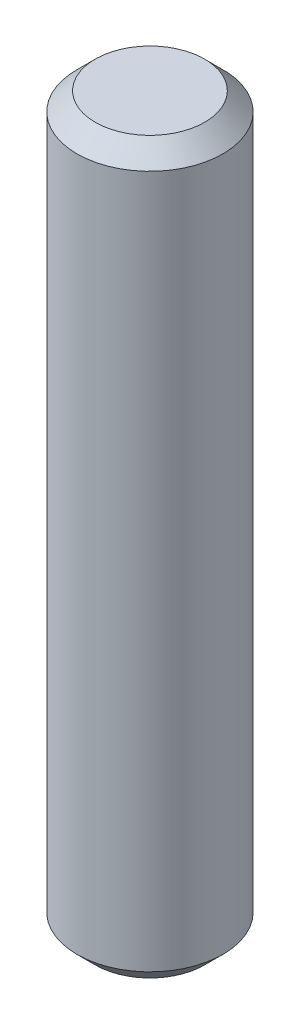
ISO-10303-21;
HEADER;
FILE_DESCRIPTION(('STEP AP214'),'2;1');
FILE_NAME('part.step','',(''),(''),'','','');
FILE_SCHEMA(('AUTOMOTIVE_DESIGN { 1 0 10303 214 1 1 1 1 }'));
ENDSEC;
DATA;
#1=APPLICATION_CONTEXT('core data for automotive mechanical design processes');
#2=APPLICATION_PROTOCOL_DEFINITION('international standard','automotive_design',2000,#1);
#3=PRODUCT_CONTEXT('',#1,'mechanical');
#4=PRODUCT('Part','Part','',(#3));
#5=PRODUCT_RELATED_PRODUCT_CATEGORY('part','',(#4));
#6=PRODUCT_DEFINITION_FORMATION('','',#4);
#7=PRODUCT_DEFINITION_CONTEXT('part definition',#1,'design');
#8=PRODUCT_DEFINITION('design','',#6,#7);
#9=PRODUCT_DEFINITION_SHAPE('','',#8);
#10=(LENGTH_UNIT() NAMED_UNIT(*) SI_UNIT(.MILLI.,.METRE.));
#11=(NAMED_UNIT(*) PLANE_ANGLE_UNIT() SI_UNIT($,.RADIAN.));
#12=(NAMED_UNIT(*) SI_UNIT($,.STERADIAN.) SOLID_ANGLE_UNIT());
#13=UNCERTAINTY_MEASURE_WITH_UNIT(LENGTH_MEASURE(1.E-05),#10,'distance_accuracy_value','');
#14=(GEOMETRIC_REPRESENTATION_CONTEXT(3) GLOBAL_UNCERTAINTY_ASSIGNED_CONTEXT((#13)) GLOBAL_UNIT_ASSIGNED_CONTEXT((#10,
#11,#12)) REPRESENTATION_CONTEXT('',''));
#15=CARTESIAN_POINT('',(0.,0.,0.));
#16=DIRECTION('',(0.,0.,1.));
#17=DIRECTION('',(1.,0.,0.));
#18=AXIS2_PLACEMENT_3D('',#15,#16,#17);
#19=CARTESIAN_POINT('',(0.,40.,0.));
#20=DIRECTION('',(0.,-1.,0.));
#21=DIRECTION('',(0.,0.,-1.));
#22=AXIS2_PLACEMENT_3D('',#19,#20,#21);
#23=CYLINDRICAL_SURFACE('',#22,4.);
#24=CARTESIAN_POINT('',(0.,1.,0.));
#25=DIRECTION('',(0.,1.,0.));
#26=DIRECTION('',(0.,0.,1.));
#27=AXIS2_PLACEMENT_3D('',#24,#25,#26);
#28=CIRCLE('',#27,4.);
#29=CARTESIAN_POINT('',(0.,1.,4.));
#30=VERTEX_POINT('',#29);
#31=EDGE_CURVE('E41',#30,#30,#28,.T.);
#32=ORIENTED_EDGE('',*,*,#31,.T.);
#33=EDGE_LOOP('',(#32));
#34=FACE_BOUND('',#33,.T.);
#35=CARTESIAN_POINT('',(0.,39.,0.));
#36=DIRECTION('',(0.,1.,0.));
#37=DIRECTION('',(0.,0.,1.));
#38=AXIS2_PLACEMENT_3D('',#35,#36,#37);
#39=CIRCLE('',#38,4.);
#40=CARTESIAN_POINT('',(0.,39.,4.));
#41=VERTEX_POINT('',#40);
#42=EDGE_CURVE('E45',#41,#41,#39,.F.);
#43=ORIENTED_EDGE('',*,*,#42,.T.);
#44=EDGE_LOOP('',(#43));
#45=FACE_BOUND('',#44,.T.);
#46=ADVANCED_FACE('F30',(#34,#45),#23,.T.);
#47=CARTESIAN_POINT('',(0.,40.,0.));
#48=DIRECTION('',(0.,1.,0.));
#49=DIRECTION('',(0.,0.,1.));
#50=AXIS2_PLACEMENT_3D('',#47,#48,#49);
#51=PLANE('',#50);
#52=CARTESIAN_POINT('',(0.,40.,0.));
#53=DIRECTION('',(0.,1.,0.));
#54=DIRECTION('',(0.,0.,1.));
#55=AXIS2_PLACEMENT_3D('',#52,#53,#54);
#56=CIRCLE('',#55,3.);
#57=CARTESIAN_POINT('',(0.,40.,3.));
#58=VERTEX_POINT('',#57);
#59=EDGE_CURVE('E10',#58,#58,#56,.T.);
#60=ORIENTED_EDGE('',*,*,#59,.T.);
#61=EDGE_LOOP('',(#60));
#62=FACE_BOUND('',#61,.T.);
#63=ADVANCED_FACE('F61',(#62),#51,.T.);
#64=CARTESIAN_POINT('',(0.,0.,0.));
#65=DIRECTION('',(0.,1.,0.));
#66=DIRECTION('',(0.,0.,1.));
#67=AXIS2_PLACEMENT_3D('',#64,#65,#66);
#68=PLANE('',#67);
#69=CARTESIAN_POINT('',(0.,0.,0.));
#70=DIRECTION('',(0.,1.,0.));
#71=DIRECTION('',(0.,0.,1.));
#72=AXIS2_PLACEMENT_3D('',#69,#70,#71);
#73=CIRCLE('',#72,3.);
#74=CARTESIAN_POINT('',(0.,0.,3.));
#75=VERTEX_POINT('',#74);
#76=EDGE_CURVE('E37',#75,#75,#73,.F.);
#77=ORIENTED_EDGE('',*,*,#76,.T.);
#78=EDGE_LOOP('',(#77));
#79=FACE_BOUND('',#78,.T.);
#80=ADVANCED_FACE('F58',(#79),#68,.F.);
#81=CARTESIAN_POINT('',(0.,1.,0.));
#82=DIRECTION('',(0.,1.,0.));
#83=DIRECTION('',(0.,0.,1.));
#84=AXIS2_PLACEMENT_3D('',#81,#82,#83);
#85=CONICAL_SURFACE('',#84,4.,0.78539816339745);
#86=ORIENTED_EDGE('',*,*,#76,.F.);
#87=EDGE_LOOP('',(#86));
#88=FACE_BOUND('',#87,.T.);
#89=ORIENTED_EDGE('',*,*,#31,.F.);
#90=EDGE_LOOP('',(#89));
#91=FACE_BOUND('',#90,.T.);
#92=ADVANCED_FACE('F54',(#88,#91),#85,.T.);
#93=CARTESIAN_POINT('',(0.,40.,0.));
#94=DIRECTION('',(0.,-1.,0.));
#95=DIRECTION('',(0.,0.,-1.));
#96=AXIS2_PLACEMENT_3D('',#93,#94,#95);
#97=CONICAL_SURFACE('',#96,3.,0.785398163397443);
#98=ORIENTED_EDGE('',*,*,#42,.F.);
#99=EDGE_LOOP('',(#98));
#100=FACE_BOUND('',#99,.T.);
#101=ORIENTED_EDGE('',*,*,#59,.F.);
#102=EDGE_LOOP('',(#101));
#103=FACE_BOUND('',#102,.T.);
#104=ADVANCED_FACE('F32',(#100,#103),#97,.T.);
#105=CLOSED_SHELL('',(#46,#63,#80,#92,#104));
#106=MANIFOLD_SOLID_BREP('B2',#105);
#107=ADVANCED_BREP_SHAPE_REPRESENTATION('',(#18,#106),#14);
#108=SHAPE_DEFINITION_REPRESENTATION(#9,#107);
ENDSEC;
END-ISO-10303-21;
